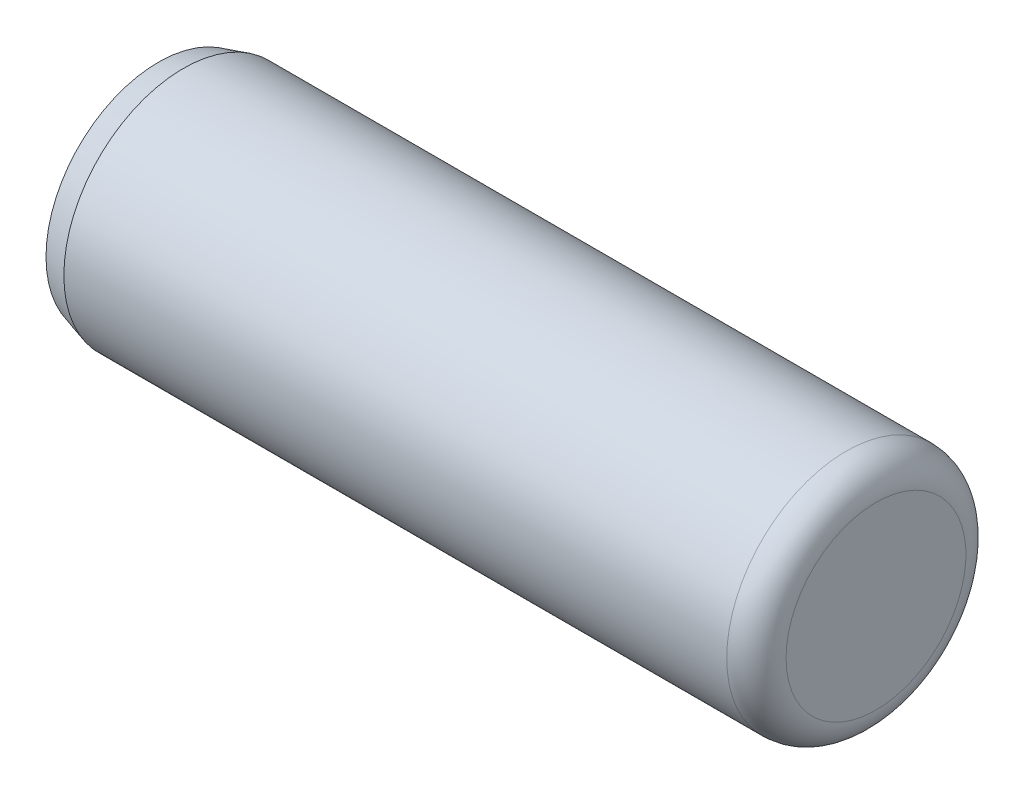
ISO-10303-21;
HEADER;
FILE_DESCRIPTION(('STEP AP214'),'2;1');
FILE_NAME('part.step','',(''),(''),'','','');
FILE_SCHEMA(('AUTOMOTIVE_DESIGN { 1 0 10303 214 1 1 1 1 }'));
ENDSEC;
DATA;
#1=APPLICATION_CONTEXT('core data for automotive mechanical design processes');
#2=APPLICATION_PROTOCOL_DEFINITION('international standard','automotive_design',2000,#1);
#3=PRODUCT_CONTEXT('',#1,'mechanical');
#4=PRODUCT('Part','Part','',(#3));
#5=PRODUCT_RELATED_PRODUCT_CATEGORY('part','',(#4));
#6=PRODUCT_DEFINITION_FORMATION('','',#4);
#7=PRODUCT_DEFINITION_CONTEXT('part definition',#1,'design');
#8=PRODUCT_DEFINITION('design','',#6,#7);
#9=PRODUCT_DEFINITION_SHAPE('','',#8);
#10=(LENGTH_UNIT() NAMED_UNIT(*) SI_UNIT(.MILLI.,.METRE.));
#11=(NAMED_UNIT(*) PLANE_ANGLE_UNIT() SI_UNIT($,.RADIAN.));
#12=(NAMED_UNIT(*) SI_UNIT($,.STERADIAN.) SOLID_ANGLE_UNIT());
#13=UNCERTAINTY_MEASURE_WITH_UNIT(LENGTH_MEASURE(1.E-05),#10,'distance_accuracy_value','');
#14=(GEOMETRIC_REPRESENTATION_CONTEXT(3) GLOBAL_UNCERTAINTY_ASSIGNED_CONTEXT((#13)) GLOBAL_UNIT_ASSIGNED_CONTEXT((#10,
#11,#12)) REPRESENTATION_CONTEXT('',''));
#15=CARTESIAN_POINT('',(0.,0.,0.));
#16=DIRECTION('',(0.,0.,1.));
#17=DIRECTION('',(1.,0.,0.));
#18=AXIS2_PLACEMENT_3D('',#15,#16,#17);
#19=CARTESIAN_POINT('',(8.7376,0.,0.));
#20=DIRECTION('',(-1.,0.,0.));
#21=DIRECTION('',(0.,0.,1.));
#22=AXIS2_PLACEMENT_3D('',#19,#20,#21);
#23=TOROIDAL_SURFACE('',#22,2.3876,0.787400000000001);
#24=CARTESIAN_POINT('',(8.7376,0.,0.));
#25=DIRECTION('',(-1.,0.,0.));
#26=DIRECTION('',(0.,0.,1.));
#27=AXIS2_PLACEMENT_3D('',#24,#25,#26);
#28=CIRCLE('',#27,3.175);
#29=CARTESIAN_POINT('',(8.7376,0.,3.175));
#30=VERTEX_POINT('',#29);
#31=EDGE_CURVE('E10',#30,#30,#28,.T.);
#32=ORIENTED_EDGE('',*,*,#31,.F.);
#33=EDGE_LOOP('',(#32));
#34=FACE_BOUND('',#33,.T.);
#35=CARTESIAN_POINT('',(9.525,0.,0.));
#36=DIRECTION('',(-1.,0.,0.));
#37=DIRECTION('',(0.,0.,1.));
#38=AXIS2_PLACEMENT_3D('',#35,#36,#37);
#39=CIRCLE('',#38,2.3876);
#40=CARTESIAN_POINT('',(9.525,0.,2.3876));
#41=VERTEX_POINT('',#40);
#42=EDGE_CURVE('E59',#41,#41,#39,.T.);
#43=ORIENTED_EDGE('',*,*,#42,.T.);
#44=EDGE_LOOP('',(#43));
#45=FACE_BOUND('',#44,.T.);
#46=ADVANCED_FACE('F41',(#34,#45),#23,.T.);
#47=CARTESIAN_POINT('',(-9.525,0.,0.));
#48=DIRECTION('',(-1.,0.,0.));
#49=DIRECTION('',(0.,0.,1.));
#50=AXIS2_PLACEMENT_3D('',#47,#48,#49);
#51=CYLINDRICAL_SURFACE('',#50,3.175);
#52=CARTESIAN_POINT('',(-8.8606475484483,0.,0.));
#53=DIRECTION('',(-1.,0.,0.));
#54=DIRECTION('',(0.,0.,1.));
#55=AXIS2_PLACEMENT_3D('',#52,#53,#54);
#56=CIRCLE('',#55,3.175);
#57=CARTESIAN_POINT('',(-8.8606475484483,0.,3.175));
#58=VERTEX_POINT('',#57);
#59=EDGE_CURVE('E48',#58,#58,#56,.T.);
#60=ORIENTED_EDGE('',*,*,#59,.F.);
#61=EDGE_LOOP('',(#60));
#62=FACE_BOUND('',#61,.T.);
#63=ORIENTED_EDGE('',*,*,#31,.T.);
#64=EDGE_LOOP('',(#63));
#65=FACE_BOUND('',#64,.T.);
#66=ADVANCED_FACE('F77',(#62,#65),#51,.T.);
#67=CARTESIAN_POINT('',(-8.8606475484483,0.,0.));
#68=DIRECTION('',(1.,0.,0.));
#69=DIRECTION('',(0.,0.,-1.));
#70=AXIS2_PLACEMENT_3D('',#67,#68,#69);
#71=CONICAL_SURFACE('',#70,3.175,0.279252680319091);
#72=CARTESIAN_POINT('',(-9.525,0.,0.));
#73=DIRECTION('',(-1.,0.,0.));
#74=DIRECTION('',(0.,0.,1.));
#75=AXIS2_PLACEMENT_3D('',#72,#73,#74);
#76=CIRCLE('',#75,2.9845);
#77=CARTESIAN_POINT('',(-9.525,0.,2.9845));
#78=VERTEX_POINT('',#77);
#79=EDGE_CURVE('E55',#78,#78,#76,.T.);
#80=ORIENTED_EDGE('',*,*,#79,.F.);
#81=EDGE_LOOP('',(#80));
#82=FACE_BOUND('',#81,.T.);
#83=ORIENTED_EDGE('',*,*,#59,.T.);
#84=EDGE_LOOP('',(#83));
#85=FACE_BOUND('',#84,.T.);
#86=ADVANCED_FACE('F74',(#82,#85),#71,.T.);
#87=CARTESIAN_POINT('',(-9.525,2.9845,0.));
#88=DIRECTION('',(1.,0.,0.));
#89=DIRECTION('',(0.,0.,-1.));
#90=AXIS2_PLACEMENT_3D('',#87,#88,#89);
#91=PLANE('',#90);
#92=ORIENTED_EDGE('',*,*,#79,.T.);
#93=EDGE_LOOP('',(#92));
#94=FACE_BOUND('',#93,.T.);
#95=ADVANCED_FACE('F68',(#94),#91,.F.);
#96=CARTESIAN_POINT('',(9.525,2.3876,0.));
#97=DIRECTION('',(-1.,0.,0.));
#98=DIRECTION('',(0.,0.,1.));
#99=AXIS2_PLACEMENT_3D('',#96,#97,#98);
#100=PLANE('',#99);
#101=ORIENTED_EDGE('',*,*,#42,.F.);
#102=EDGE_LOOP('',(#101));
#103=FACE_BOUND('',#102,.T.);
#104=ADVANCED_FACE('F66',(#103),#100,.F.);
#105=CLOSED_SHELL('',(#46,#66,#86,#95,#104));
#106=MANIFOLD_SOLID_BREP('B2',#105);
#107=ADVANCED_BREP_SHAPE_REPRESENTATION('',(#18,#106),#14);
#108=SHAPE_DEFINITION_REPRESENTATION(#9,#107);
ENDSEC;
END-ISO-10303-21;
